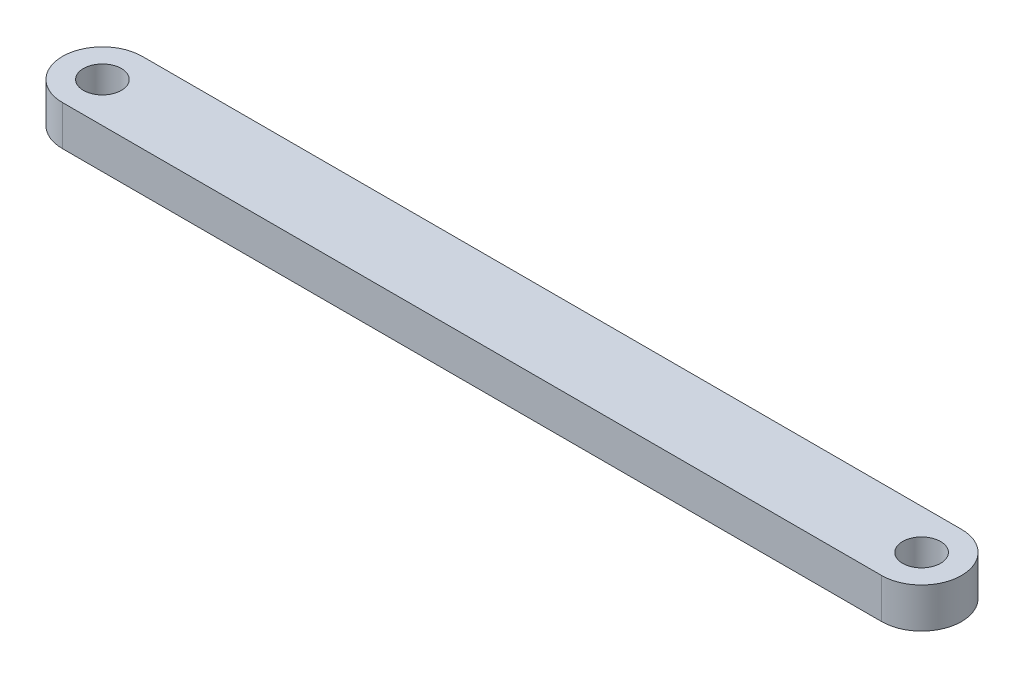
ISO-10303-21;
HEADER;
FILE_DESCRIPTION(('STEP AP214'),'2;1');
FILE_NAME('part.step','',(''),(''),'','','');
FILE_SCHEMA(('AUTOMOTIVE_DESIGN { 1 0 10303 214 1 1 1 1 }'));
ENDSEC;
DATA;
#1=APPLICATION_CONTEXT('core data for automotive mechanical design processes');
#2=APPLICATION_PROTOCOL_DEFINITION('international standard','automotive_design',2000,#1);
#3=PRODUCT_CONTEXT('',#1,'mechanical');
#4=PRODUCT('Part','Part','',(#3));
#5=PRODUCT_RELATED_PRODUCT_CATEGORY('part','',(#4));
#6=PRODUCT_DEFINITION_FORMATION('','',#4);
#7=PRODUCT_DEFINITION_CONTEXT('part definition',#1,'design');
#8=PRODUCT_DEFINITION('design','',#6,#7);
#9=PRODUCT_DEFINITION_SHAPE('','',#8);
#10=(LENGTH_UNIT() NAMED_UNIT(*) SI_UNIT(.MILLI.,.METRE.));
#11=(NAMED_UNIT(*) PLANE_ANGLE_UNIT() SI_UNIT($,.RADIAN.));
#12=(NAMED_UNIT(*) SI_UNIT($,.STERADIAN.) SOLID_ANGLE_UNIT());
#13=UNCERTAINTY_MEASURE_WITH_UNIT(LENGTH_MEASURE(1.E-05),#10,'distance_accuracy_value','');
#14=(GEOMETRIC_REPRESENTATION_CONTEXT(3) GLOBAL_UNCERTAINTY_ASSIGNED_CONTEXT((#13)) GLOBAL_UNIT_ASSIGNED_CONTEXT((#10,
#11,#12)) REPRESENTATION_CONTEXT('',''));
#15=CARTESIAN_POINT('',(0.,0.,0.));
#16=DIRECTION('',(0.,0.,1.));
#17=DIRECTION('',(1.,0.,0.));
#18=AXIS2_PLACEMENT_3D('',#15,#16,#17);
#19=CARTESIAN_POINT('',(-20.5,1.,0.));
#20=DIRECTION('',(0.,1.,0.));
#21=DIRECTION('',(0.,0.,1.));
#22=AXIS2_PLACEMENT_3D('',#19,#20,#21);
#23=PLANE('',#22);
#24=CARTESIAN_POINT('',(-20.5,1.,0.));
#25=DIRECTION('',(0.,1.,0.));
#26=DIRECTION('',(0.,0.,1.));
#27=AXIS2_PLACEMENT_3D('',#24,#25,#26);
#28=CIRCLE('',#27,0.950000000000001);
#29=CARTESIAN_POINT('',(-20.5,1.,0.950000000000001));
#30=VERTEX_POINT('',#29);
#31=EDGE_CURVE('E100',#30,#30,#28,.T.);
#32=ORIENTED_EDGE('',*,*,#31,.F.);
#33=EDGE_LOOP('',(#32));
#34=FACE_BOUND('',#33,.T.);
#35=CARTESIAN_POINT('',(-20.5,1.,0.));
#36=DIRECTION('',(0.,1.,0.));
#37=DIRECTION('',(0.,0.,1.));
#38=AXIS2_PLACEMENT_3D('',#35,#36,#37);
#39=CIRCLE('',#38,2.);
#40=CARTESIAN_POINT('',(-20.5,1.,-2.));
#41=VERTEX_POINT('',#40);
#42=CARTESIAN_POINT('',(-20.5,1.,2.));
#43=VERTEX_POINT('',#42);
#44=EDGE_CURVE('E85',#41,#43,#39,.T.);
#45=ORIENTED_EDGE('',*,*,#44,.T.);
#46=DIRECTION('',(1.,0.,0.));
#47=VECTOR('',#46,1.);
#48=CARTESIAN_POINT('',(-20.5,1.,2.));
#49=LINE('',#48,#47);
#50=CARTESIAN_POINT('',(20.5,1.,2.));
#51=VERTEX_POINT('',#50);
#52=EDGE_CURVE('E80',#43,#51,#49,.T.);
#53=ORIENTED_EDGE('',*,*,#52,.T.);
#54=CARTESIAN_POINT('',(20.5,1.,0.));
#55=DIRECTION('',(0.,1.,0.));
#56=DIRECTION('',(0.,0.,1.));
#57=AXIS2_PLACEMENT_3D('',#54,#55,#56);
#58=CIRCLE('',#57,2.);
#59=CARTESIAN_POINT('',(20.5,1.,-2.00000000000001));
#60=VERTEX_POINT('',#59);
#61=EDGE_CURVE('E83',#51,#60,#58,.T.);
#62=ORIENTED_EDGE('',*,*,#61,.T.);
#63=DIRECTION('',(-1.,0.,0.));
#64=VECTOR('',#63,1.);
#65=CARTESIAN_POINT('',(-20.5,1.,-2.));
#66=LINE('',#65,#64);
#67=EDGE_CURVE('E50',#60,#41,#66,.T.);
#68=ORIENTED_EDGE('',*,*,#67,.T.);
#69=EDGE_LOOP('',(#45,#53,#62,#68));
#70=FACE_BOUND('',#69,.T.);
#71=CARTESIAN_POINT('',(20.5,1.,0.));
#72=DIRECTION('',(0.,1.,0.));
#73=DIRECTION('',(0.,0.,1.));
#74=AXIS2_PLACEMENT_3D('',#71,#72,#73);
#75=CIRCLE('',#74,0.950000000000001);
#76=CARTESIAN_POINT('',(20.5,1.,0.950000000000001));
#77=VERTEX_POINT('',#76);
#78=EDGE_CURVE('E115',#77,#77,#75,.T.);
#79=ORIENTED_EDGE('',*,*,#78,.F.);
#80=EDGE_LOOP('',(#79));
#81=FACE_BOUND('',#80,.T.);
#82=ADVANCED_FACE('F33',(#34,#70,#81),#23,.T.);
#83=CARTESIAN_POINT('',(-20.5,-1.,0.));
#84=DIRECTION('',(0.,1.,0.));
#85=DIRECTION('',(0.,0.,1.));
#86=AXIS2_PLACEMENT_3D('',#83,#84,#85);
#87=PLANE('',#86);
#88=CARTESIAN_POINT('',(-20.5,-1.,0.));
#89=DIRECTION('',(0.,1.,0.));
#90=DIRECTION('',(0.,0.,1.));
#91=AXIS2_PLACEMENT_3D('',#88,#89,#90);
#92=CIRCLE('',#91,2.);
#93=CARTESIAN_POINT('',(-20.5,-1.,-2.));
#94=VERTEX_POINT('',#93);
#95=CARTESIAN_POINT('',(-20.5,-1.,2.));
#96=VERTEX_POINT('',#95);
#97=EDGE_CURVE('E97',#94,#96,#92,.T.);
#98=ORIENTED_EDGE('',*,*,#97,.F.);
#99=DIRECTION('',(-1.,0.,0.));
#100=VECTOR('',#99,1.);
#101=CARTESIAN_POINT('',(-20.5,-1.,-2.));
#102=LINE('',#101,#100);
#103=CARTESIAN_POINT('',(20.5,-1.,-2.00000000000001));
#104=VERTEX_POINT('',#103);
#105=EDGE_CURVE('E73',#104,#94,#102,.T.);
#106=ORIENTED_EDGE('',*,*,#105,.F.);
#107=CARTESIAN_POINT('',(20.5,-1.,0.));
#108=DIRECTION('',(0.,1.,0.));
#109=DIRECTION('',(0.,0.,1.));
#110=AXIS2_PLACEMENT_3D('',#107,#108,#109);
#111=CIRCLE('',#110,2.);
#112=CARTESIAN_POINT('',(20.5,-1.,2.));
#113=VERTEX_POINT('',#112);
#114=EDGE_CURVE('E67',#113,#104,#111,.T.);
#115=ORIENTED_EDGE('',*,*,#114,.F.);
#116=DIRECTION('',(1.,0.,0.));
#117=VECTOR('',#116,1.);
#118=CARTESIAN_POINT('',(-20.5,-1.,2.));
#119=LINE('',#118,#117);
#120=EDGE_CURVE('E89',#96,#113,#119,.T.);
#121=ORIENTED_EDGE('',*,*,#120,.F.);
#122=EDGE_LOOP('',(#98,#106,#115,#121));
#123=FACE_BOUND('',#122,.T.);
#124=CARTESIAN_POINT('',(-20.5,-1.,0.));
#125=DIRECTION('',(0.,1.,0.));
#126=DIRECTION('',(0.,0.,1.));
#127=AXIS2_PLACEMENT_3D('',#124,#125,#126);
#128=CIRCLE('',#127,0.950000000000001);
#129=CARTESIAN_POINT('',(-20.5,-1.,0.950000000000001));
#130=VERTEX_POINT('',#129);
#131=EDGE_CURVE('E112',#130,#130,#128,.T.);
#132=ORIENTED_EDGE('',*,*,#131,.T.);
#133=EDGE_LOOP('',(#132));
#134=FACE_BOUND('',#133,.T.);
#135=CARTESIAN_POINT('',(20.5,-1.,0.));
#136=DIRECTION('',(0.,1.,0.));
#137=DIRECTION('',(0.,0.,1.));
#138=AXIS2_PLACEMENT_3D('',#135,#136,#137);
#139=CIRCLE('',#138,0.950000000000001);
#140=CARTESIAN_POINT('',(20.5,-1.,0.950000000000001));
#141=VERTEX_POINT('',#140);
#142=EDGE_CURVE('E118',#141,#141,#139,.T.);
#143=ORIENTED_EDGE('',*,*,#142,.T.);
#144=EDGE_LOOP('',(#143));
#145=FACE_BOUND('',#144,.T.);
#146=ADVANCED_FACE('F108',(#123,#134,#145),#87,.F.);
#147=CARTESIAN_POINT('',(-20.5,1.,0.));
#148=DIRECTION('',(0.,-1.,0.));
#149=DIRECTION('',(0.,0.,-1.));
#150=AXIS2_PLACEMENT_3D('',#147,#148,#149);
#151=CYLINDRICAL_SURFACE('',#150,2.);
#152=ORIENTED_EDGE('',*,*,#97,.T.);
#153=DIRECTION('',(0.,-1.,0.));
#154=VECTOR('',#153,1.);
#155=CARTESIAN_POINT('',(-20.5,1.,2.));
#156=LINE('',#155,#154);
#157=EDGE_CURVE('E11',#43,#96,#156,.T.);
#158=ORIENTED_EDGE('',*,*,#157,.F.);
#159=ORIENTED_EDGE('',*,*,#44,.F.);
#160=DIRECTION('',(0.,-1.,0.));
#161=VECTOR('',#160,1.);
#162=CARTESIAN_POINT('',(-20.5,1.,-2.));
#163=LINE('',#162,#161);
#164=EDGE_CURVE('E93',#41,#94,#163,.T.);
#165=ORIENTED_EDGE('',*,*,#164,.T.);
#166=EDGE_LOOP('',(#152,#158,#159,#165));
#167=FACE_BOUND('',#166,.T.);
#168=ADVANCED_FACE('F35',(#167),#151,.T.);
#169=CARTESIAN_POINT('',(-20.5,1.,2.));
#170=DIRECTION('',(0.,0.,-1.));
#171=DIRECTION('',(-1.,0.,0.));
#172=AXIS2_PLACEMENT_3D('',#169,#170,#171);
#173=PLANE('',#172);
#174=ORIENTED_EDGE('',*,*,#120,.T.);
#175=DIRECTION('',(0.,-1.,0.));
#176=VECTOR('',#175,1.);
#177=CARTESIAN_POINT('',(20.5,1.,2.));
#178=LINE('',#177,#176);
#179=EDGE_CURVE('E42',#51,#113,#178,.T.);
#180=ORIENTED_EDGE('',*,*,#179,.F.);
#181=ORIENTED_EDGE('',*,*,#52,.F.);
#182=ORIENTED_EDGE('',*,*,#157,.T.);
#183=EDGE_LOOP('',(#174,#180,#181,#182));
#184=FACE_BOUND('',#183,.T.);
#185=ADVANCED_FACE('F88',(#184),#173,.F.);
#186=CARTESIAN_POINT('',(20.5,1.,0.));
#187=DIRECTION('',(0.,-1.,0.));
#188=DIRECTION('',(0.,0.,-1.));
#189=AXIS2_PLACEMENT_3D('',#186,#187,#188);
#190=CYLINDRICAL_SURFACE('',#189,2.);
#191=ORIENTED_EDGE('',*,*,#114,.T.);
#192=DIRECTION('',(0.,-1.,0.));
#193=VECTOR('',#192,1.);
#194=CARTESIAN_POINT('',(20.5,1.,-2.00000000000001));
#195=LINE('',#194,#193);
#196=EDGE_CURVE('E90',#60,#104,#195,.T.);
#197=ORIENTED_EDGE('',*,*,#196,.F.);
#198=ORIENTED_EDGE('',*,*,#61,.F.);
#199=ORIENTED_EDGE('',*,*,#179,.T.);
#200=EDGE_LOOP('',(#191,#197,#198,#199));
#201=FACE_BOUND('',#200,.T.);
#202=ADVANCED_FACE('F91',(#201),#190,.T.);
#203=CARTESIAN_POINT('',(-20.5,1.,-2.));
#204=DIRECTION('',(0.,0.,1.));
#205=DIRECTION('',(1.,0.,0.));
#206=AXIS2_PLACEMENT_3D('',#203,#204,#205);
#207=PLANE('',#206);
#208=ORIENTED_EDGE('',*,*,#105,.T.);
#209=ORIENTED_EDGE('',*,*,#164,.F.);
#210=ORIENTED_EDGE('',*,*,#67,.F.);
#211=ORIENTED_EDGE('',*,*,#196,.T.);
#212=EDGE_LOOP('',(#208,#209,#210,#211));
#213=FACE_BOUND('',#212,.T.);
#214=ADVANCED_FACE('F105',(#213),#207,.F.);
#215=CARTESIAN_POINT('',(-20.5,1.,0.));
#216=DIRECTION('',(0.,-1.,0.));
#217=DIRECTION('',(0.,0.,-1.));
#218=AXIS2_PLACEMENT_3D('',#215,#216,#217);
#219=CYLINDRICAL_SURFACE('',#218,0.950000000000001);
#220=ORIENTED_EDGE('',*,*,#31,.T.);
#221=EDGE_LOOP('',(#220));
#222=FACE_BOUND('',#221,.T.);
#223=ORIENTED_EDGE('',*,*,#131,.F.);
#224=EDGE_LOOP('',(#223));
#225=FACE_BOUND('',#224,.T.);
#226=ADVANCED_FACE('F135',(#222,#225),#219,.F.);
#227=CARTESIAN_POINT('',(20.5,1.,0.));
#228=DIRECTION('',(0.,-1.,0.));
#229=DIRECTION('',(0.,0.,-1.));
#230=AXIS2_PLACEMENT_3D('',#227,#228,#229);
#231=CYLINDRICAL_SURFACE('',#230,0.950000000000001);
#232=ORIENTED_EDGE('',*,*,#78,.T.);
#233=EDGE_LOOP('',(#232));
#234=FACE_BOUND('',#233,.T.);
#235=ORIENTED_EDGE('',*,*,#142,.F.);
#236=EDGE_LOOP('',(#235));
#237=FACE_BOUND('',#236,.T.);
#238=ADVANCED_FACE('F124',(#234,#237),#231,.F.);
#239=CLOSED_SHELL('',(#82,#146,#168,#185,#202,#214,#226,#238));
#240=MANIFOLD_SOLID_BREP('B2',#239);
#241=ADVANCED_BREP_SHAPE_REPRESENTATION('',(#18,#240),#14);
#242=SHAPE_DEFINITION_REPRESENTATION(#9,#241);
ENDSEC;
END-ISO-10303-21;
